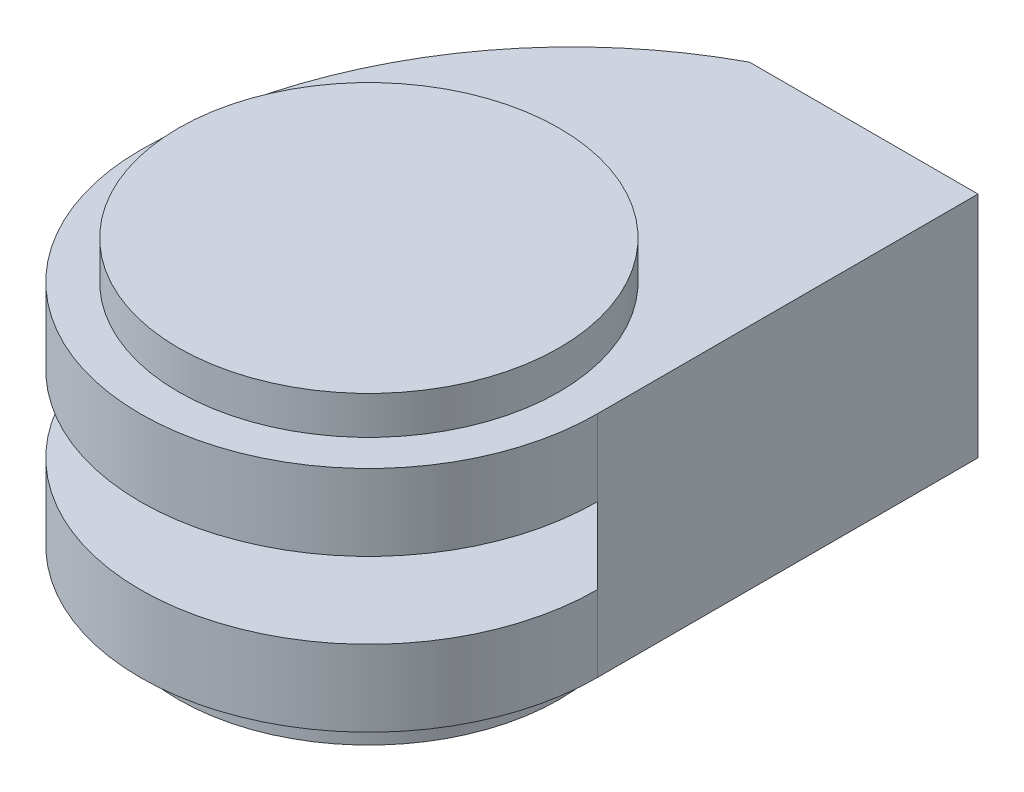
ISO-10303-21;
HEADER;
FILE_DESCRIPTION(('STEP AP214'),'2;1');
FILE_NAME('part.step','',(''),(''),'','','');
FILE_SCHEMA(('AUTOMOTIVE_DESIGN { 1 0 10303 214 1 1 1 1 }'));
ENDSEC;
DATA;
#1=APPLICATION_CONTEXT('core data for automotive mechanical design processes');
#2=APPLICATION_PROTOCOL_DEFINITION('international standard','automotive_design',2000,#1);
#3=PRODUCT_CONTEXT('',#1,'mechanical');
#4=PRODUCT('Part','Part','',(#3));
#5=PRODUCT_RELATED_PRODUCT_CATEGORY('part','',(#4));
#6=PRODUCT_DEFINITION_FORMATION('','',#4);
#7=PRODUCT_DEFINITION_CONTEXT('part definition',#1,'design');
#8=PRODUCT_DEFINITION('design','',#6,#7);
#9=PRODUCT_DEFINITION_SHAPE('','',#8);
#10=(LENGTH_UNIT() NAMED_UNIT(*) SI_UNIT(.MILLI.,.METRE.));
#11=(NAMED_UNIT(*) PLANE_ANGLE_UNIT() SI_UNIT($,.RADIAN.));
#12=(NAMED_UNIT(*) SI_UNIT($,.STERADIAN.) SOLID_ANGLE_UNIT());
#13=UNCERTAINTY_MEASURE_WITH_UNIT(LENGTH_MEASURE(1.E-05),#10,'distance_accuracy_value','');
#14=(GEOMETRIC_REPRESENTATION_CONTEXT(3) GLOBAL_UNCERTAINTY_ASSIGNED_CONTEXT((#13)) GLOBAL_UNIT_ASSIGNED_CONTEXT((#10,
#11,#12)) REPRESENTATION_CONTEXT('',''));
#15=CARTESIAN_POINT('',(0.,0.,0.));
#16=DIRECTION('',(0.,0.,1.));
#17=DIRECTION('',(1.,0.,0.));
#18=AXIS2_PLACEMENT_3D('',#15,#16,#17);
#19=CARTESIAN_POINT('',(0.,-1.5,2.5));
#20=DIRECTION('',(0.,1.,0.));
#21=DIRECTION('',(0.,0.,1.));
#22=AXIS2_PLACEMENT_3D('',#19,#20,#21);
#23=CYLINDRICAL_SURFACE('',#22,3.);
#24=DIRECTION('',(0.,1.,0.));
#25=VECTOR('',#24,1.);
#26=CARTESIAN_POINT('',(3.,-1.5,2.5));
#27=LINE('',#26,#25);
#28=CARTESIAN_POINT('',(3.,-1.5,2.5));
#29=VERTEX_POINT('',#28);
#30=CARTESIAN_POINT('',(3.,-0.5,2.5));
#31=VERTEX_POINT('',#30);
#32=EDGE_CURVE('E163',#29,#31,#27,.T.);
#33=ORIENTED_EDGE('',*,*,#32,.T.);
#34=CARTESIAN_POINT('',(0.,-0.5,2.5));
#35=DIRECTION('',(0.,1.,0.));
#36=DIRECTION('',(0.,0.,1.));
#37=AXIS2_PLACEMENT_3D('',#34,#35,#36);
#38=CIRCLE('',#37,3.);
#39=CARTESIAN_POINT('',(-3.,-0.5,2.5));
#40=VERTEX_POINT('',#39);
#41=EDGE_CURVE('E54',#40,#31,#38,.T.);
#42=ORIENTED_EDGE('',*,*,#41,.F.);
#43=DIRECTION('',(0.,1.,0.));
#44=VECTOR('',#43,1.);
#45=CARTESIAN_POINT('',(-3.,-1.5,2.5));
#46=LINE('',#45,#44);
#47=CARTESIAN_POINT('',(-3.,-1.5,2.5));
#48=VERTEX_POINT('',#47);
#49=EDGE_CURVE('E61',#48,#40,#46,.T.);
#50=ORIENTED_EDGE('',*,*,#49,.F.);
#51=CARTESIAN_POINT('',(0.,-1.5,2.5));
#52=DIRECTION('',(0.,1.,0.));
#53=DIRECTION('',(0.,0.,1.));
#54=AXIS2_PLACEMENT_3D('',#51,#52,#53);
#55=CIRCLE('',#54,3.);
#56=EDGE_CURVE('E146',#48,#29,#55,.T.);
#57=ORIENTED_EDGE('',*,*,#56,.T.);
#58=EDGE_LOOP('',(#33,#42,#50,#57));
#59=FACE_BOUND('',#58,.T.);
#60=ADVANCED_FACE('F37',(#59),#23,.T.);
#61=CARTESIAN_POINT('',(0.,0.5,2.5));
#62=DIRECTION('',(0.,1.,0.));
#63=DIRECTION('',(0.,0.,1.));
#64=AXIS2_PLACEMENT_3D('',#61,#62,#63);
#65=CIRCLE('',#64,3.);
#66=CARTESIAN_POINT('',(-3.,0.5,2.5));
#67=VERTEX_POINT('',#66);
#68=CARTESIAN_POINT('',(3.,0.5,2.5));
#69=VERTEX_POINT('',#68);
#70=EDGE_CURVE('E129',#67,#69,#65,.T.);
#71=ORIENTED_EDGE('',*,*,#70,.T.);
#72=CARTESIAN_POINT('',(3.,1.5,2.5));
#73=VERTEX_POINT('',#72);
#74=EDGE_CURVE('E157',#69,#73,#27,.T.);
#75=ORIENTED_EDGE('',*,*,#74,.T.);
#76=CARTESIAN_POINT('',(0.,1.5,2.5));
#77=DIRECTION('',(0.,1.,0.));
#78=DIRECTION('',(0.,0.,1.));
#79=AXIS2_PLACEMENT_3D('',#76,#77,#78);
#80=CIRCLE('',#79,3.);
#81=CARTESIAN_POINT('',(-3.,1.5,2.5));
#82=VERTEX_POINT('',#81);
#83=EDGE_CURVE('E134',#82,#73,#80,.T.);
#84=ORIENTED_EDGE('',*,*,#83,.F.);
#85=EDGE_CURVE('E159',#67,#82,#46,.T.);
#86=ORIENTED_EDGE('',*,*,#85,.F.);
#87=EDGE_LOOP('',(#71,#75,#84,#86));
#88=FACE_BOUND('',#87,.T.);
#89=ADVANCED_FACE('F39',(#88),#23,.T.);
#90=CARTESIAN_POINT('',(2.66666666666666,-1.5,2.5));
#91=DIRECTION('',(0.,1.,0.));
#92=DIRECTION('',(0.,0.,1.));
#93=AXIS2_PLACEMENT_3D('',#90,#91,#92);
#94=CYLINDRICAL_SURFACE('',#93,5.66666666666666);
#95=CARTESIAN_POINT('',(2.66666666666666,0.5,2.5));
#96=DIRECTION('',(0.,1.,0.));
#97=DIRECTION('',(0.,0.,1.));
#98=AXIS2_PLACEMENT_3D('',#95,#96,#97);
#99=CIRCLE('',#98,5.66666666666666);
#100=CARTESIAN_POINT('',(-0.474039748060163,0.5,-2.21668043517948));
#101=VERTEX_POINT('',#100);
#102=EDGE_CURVE('E127',#67,#101,#99,.F.);
#103=ORIENTED_EDGE('',*,*,#102,.F.);
#104=ORIENTED_EDGE('',*,*,#85,.T.);
#105=CARTESIAN_POINT('',(2.66666666666666,1.5,2.5));
#106=DIRECTION('',(0.,1.,0.));
#107=DIRECTION('',(0.,0.,1.));
#108=AXIS2_PLACEMENT_3D('',#105,#106,#107);
#109=CIRCLE('',#108,5.66666666666666);
#110=CARTESIAN_POINT('',(0.,1.5,-2.5));
#111=VERTEX_POINT('',#110);
#112=EDGE_CURVE('E143',#111,#82,#109,.T.);
#113=ORIENTED_EDGE('',*,*,#112,.F.);
#114=DIRECTION('',(0.,1.,0.));
#115=VECTOR('',#114,1.);
#116=CARTESIAN_POINT('',(0.,-1.5,-2.5));
#117=LINE('',#116,#115);
#118=CARTESIAN_POINT('',(0.,-1.5,-2.5));
#119=VERTEX_POINT('',#118);
#120=EDGE_CURVE('E160',#119,#111,#117,.T.);
#121=ORIENTED_EDGE('',*,*,#120,.F.);
#122=CARTESIAN_POINT('',(2.66666666666666,-1.5,2.5));
#123=DIRECTION('',(0.,1.,0.));
#124=DIRECTION('',(0.,0.,1.));
#125=AXIS2_PLACEMENT_3D('',#122,#123,#124);
#126=CIRCLE('',#125,5.66666666666666);
#127=EDGE_CURVE('E154',#119,#48,#126,.T.);
#128=ORIENTED_EDGE('',*,*,#127,.T.);
#129=ORIENTED_EDGE('',*,*,#49,.T.);
#130=CARTESIAN_POINT('',(2.66666666666666,-0.5,2.5));
#131=DIRECTION('',(0.,1.,0.));
#132=DIRECTION('',(0.,0.,1.));
#133=AXIS2_PLACEMENT_3D('',#130,#131,#132);
#134=CIRCLE('',#133,5.66666666666666);
#135=CARTESIAN_POINT('',(-0.474039748060163,-0.5,-2.21668043517948));
#136=VERTEX_POINT('',#135);
#137=EDGE_CURVE('E124',#40,#136,#134,.F.);
#138=ORIENTED_EDGE('',*,*,#137,.T.);
#139=DIRECTION('',(0.,1.,0.));
#140=VECTOR('',#139,1.);
#141=CARTESIAN_POINT('',(-0.474039748060163,-1.5,-2.21668043517948));
#142=LINE('',#141,#140);
#143=EDGE_CURVE('E41',#101,#136,#142,.F.);
#144=ORIENTED_EDGE('',*,*,#143,.F.);
#145=EDGE_LOOP('',(#103,#104,#113,#121,#128,#129,#138,#144));
#146=FACE_BOUND('',#145,.T.);
#147=ADVANCED_FACE('F180',(#146),#94,.T.);
#148=CARTESIAN_POINT('',(0.,-1.5,-2.5));
#149=DIRECTION('',(0.,0.,-1.));
#150=DIRECTION('',(-1.,0.,0.));
#151=AXIS2_PLACEMENT_3D('',#148,#149,#150);
#152=PLANE('',#151);
#153=ORIENTED_EDGE('',*,*,#120,.T.);
#154=DIRECTION('',(-1.,0.,0.));
#155=VECTOR('',#154,1.);
#156=CARTESIAN_POINT('',(0.,1.5,-2.5));
#157=LINE('',#156,#155);
#158=CARTESIAN_POINT('',(3.,1.5,-2.5));
#159=VERTEX_POINT('',#158);
#160=EDGE_CURVE('E140',#159,#111,#157,.T.);
#161=ORIENTED_EDGE('',*,*,#160,.F.);
#162=DIRECTION('',(0.,1.,0.));
#163=VECTOR('',#162,1.);
#164=CARTESIAN_POINT('',(3.,-1.5,-2.5));
#165=LINE('',#164,#163);
#166=CARTESIAN_POINT('',(3.,-1.5,-2.5));
#167=VERTEX_POINT('',#166);
#168=EDGE_CURVE('E162',#167,#159,#165,.T.);
#169=ORIENTED_EDGE('',*,*,#168,.F.);
#170=DIRECTION('',(-1.,0.,0.));
#171=VECTOR('',#170,1.);
#172=CARTESIAN_POINT('',(0.,-1.5,-2.5));
#173=LINE('',#172,#171);
#174=EDGE_CURVE('E151',#167,#119,#173,.T.);
#175=ORIENTED_EDGE('',*,*,#174,.T.);
#176=EDGE_LOOP('',(#153,#161,#169,#175));
#177=FACE_BOUND('',#176,.T.);
#178=ADVANCED_FACE('F215',(#177),#152,.T.);
#179=CARTESIAN_POINT('',(3.,-1.5,0.));
#180=DIRECTION('',(1.,0.,0.));
#181=DIRECTION('',(0.,0.,-1.));
#182=AXIS2_PLACEMENT_3D('',#179,#180,#181);
#183=PLANE('',#182);
#184=ORIENTED_EDGE('',*,*,#168,.T.);
#185=DIRECTION('',(0.,0.,-1.));
#186=VECTOR('',#185,1.);
#187=CARTESIAN_POINT('',(3.,1.5,0.));
#188=LINE('',#187,#186);
#189=EDGE_CURVE('E137',#73,#159,#188,.T.);
#190=ORIENTED_EDGE('',*,*,#189,.F.);
#191=ORIENTED_EDGE('',*,*,#74,.F.);
#192=EDGE_CURVE('E165',#31,#69,#27,.T.);
#193=ORIENTED_EDGE('',*,*,#192,.F.);
#194=ORIENTED_EDGE('',*,*,#32,.F.);
#195=DIRECTION('',(0.,0.,-1.));
#196=VECTOR('',#195,1.);
#197=CARTESIAN_POINT('',(3.,-1.5,0.));
#198=LINE('',#197,#196);
#199=EDGE_CURVE('E148',#29,#167,#198,.T.);
#200=ORIENTED_EDGE('',*,*,#199,.T.);
#201=EDGE_LOOP('',(#184,#190,#191,#193,#194,#200));
#202=FACE_BOUND('',#201,.T.);
#203=ADVANCED_FACE('F173',(#202),#183,.T.);
#204=CARTESIAN_POINT('',(0.,-1.5,0.));
#205=DIRECTION('',(0.,1.,0.));
#206=DIRECTION('',(0.,0.,1.));
#207=AXIS2_PLACEMENT_3D('',#204,#205,#206);
#208=PLANE('',#207);
#209=CARTESIAN_POINT('',(0.,-1.5,2.5));
#210=DIRECTION('',(0.,-1.,0.));
#211=DIRECTION('',(0.,0.,-1.));
#212=AXIS2_PLACEMENT_3D('',#209,#210,#211);
#213=CIRCLE('',#212,2.5);
#214=CARTESIAN_POINT('',(0.,-1.5,0.));
#215=VERTEX_POINT('',#214);
#216=EDGE_CURVE('E11',#215,#215,#213,.T.);
#217=ORIENTED_EDGE('',*,*,#216,.F.);
#218=EDGE_LOOP('',(#217));
#219=FACE_BOUND('',#218,.T.);
#220=ORIENTED_EDGE('',*,*,#56,.F.);
#221=ORIENTED_EDGE('',*,*,#127,.F.);
#222=ORIENTED_EDGE('',*,*,#174,.F.);
#223=ORIENTED_EDGE('',*,*,#199,.F.);
#224=EDGE_LOOP('',(#220,#221,#222,#223));
#225=FACE_BOUND('',#224,.T.);
#226=ADVANCED_FACE('F201',(#219,#225),#208,.F.);
#227=CARTESIAN_POINT('',(0.,1.5,0.));
#228=DIRECTION('',(0.,1.,0.));
#229=DIRECTION('',(0.,0.,1.));
#230=AXIS2_PLACEMENT_3D('',#227,#228,#229);
#231=PLANE('',#230);
#232=CARTESIAN_POINT('',(0.,1.5,2.5));
#233=DIRECTION('',(0.,1.,0.));
#234=DIRECTION('',(0.,0.,1.));
#235=AXIS2_PLACEMENT_3D('',#232,#233,#234);
#236=CIRCLE('',#235,2.5);
#237=CARTESIAN_POINT('',(0.,1.5,5.));
#238=VERTEX_POINT('',#237);
#239=EDGE_CURVE('E46',#238,#238,#236,.T.);
#240=ORIENTED_EDGE('',*,*,#239,.F.);
#241=EDGE_LOOP('',(#240));
#242=FACE_BOUND('',#241,.T.);
#243=ORIENTED_EDGE('',*,*,#83,.T.);
#244=ORIENTED_EDGE('',*,*,#189,.T.);
#245=ORIENTED_EDGE('',*,*,#160,.T.);
#246=ORIENTED_EDGE('',*,*,#112,.T.);
#247=EDGE_LOOP('',(#243,#244,#245,#246));
#248=FACE_BOUND('',#247,.T.);
#249=ADVANCED_FACE('F176',(#242,#248),#231,.T.);
#250=CARTESIAN_POINT('',(0.,0.5,2.5));
#251=DIRECTION('',(0.,-1.,0.));
#252=DIRECTION('',(0.,0.,-1.));
#253=AXIS2_PLACEMENT_3D('',#250,#251,#252);
#254=CYLINDRICAL_SURFACE('',#253,3.);
#255=ORIENTED_EDGE('',*,*,#192,.T.);
#256=CARTESIAN_POINT('',(2.12132034355965,0.5,0.378679656440368));
#257=VERTEX_POINT('',#256);
#258=EDGE_CURVE('E113',#69,#257,#65,.T.);
#259=ORIENTED_EDGE('',*,*,#258,.T.);
#260=DIRECTION('',(0.,-1.,0.));
#261=VECTOR('',#260,1.);
#262=CARTESIAN_POINT('',(2.12132034355965,0.5,0.378679656440368));
#263=LINE('',#262,#261);
#264=CARTESIAN_POINT('',(2.12132034355965,-0.5,0.378679656440368));
#265=VERTEX_POINT('',#264);
#266=EDGE_CURVE('E110',#257,#265,#263,.T.);
#267=ORIENTED_EDGE('',*,*,#266,.T.);
#268=EDGE_CURVE('E115',#31,#265,#38,.T.);
#269=ORIENTED_EDGE('',*,*,#268,.F.);
#270=EDGE_LOOP('',(#255,#259,#267,#269));
#271=FACE_BOUND('',#270,.T.);
#272=ADVANCED_FACE('F122',(#271),#254,.F.);
#273=CARTESIAN_POINT('',(0.871320343559654,0.5,-0.871320343559645));
#274=DIRECTION('',(0.707106781186551,0.,-0.707106781186544));
#275=DIRECTION('',(-0.707106781186544,0.,-0.707106781186551));
#276=AXIS2_PLACEMENT_3D('',#273,#274,#275);
#277=PLANE('',#276);
#278=ORIENTED_EDGE('',*,*,#143,.T.);
#279=DIRECTION('',(0.707106781186544,0.,0.707106781186551));
#280=VECTOR('',#279,1.);
#281=CARTESIAN_POINT('',(0.871320343559654,-0.5,-0.871320343559645));
#282=LINE('',#281,#280);
#283=EDGE_CURVE('E106',#136,#265,#282,.T.);
#284=ORIENTED_EDGE('',*,*,#283,.T.);
#285=ORIENTED_EDGE('',*,*,#266,.F.);
#286=DIRECTION('',(0.707106781186544,0.,0.707106781186551));
#287=VECTOR('',#286,1.);
#288=CARTESIAN_POINT('',(0.871320343559654,0.5,-0.871320343559645));
#289=LINE('',#288,#287);
#290=EDGE_CURVE('E125',#101,#257,#289,.T.);
#291=ORIENTED_EDGE('',*,*,#290,.F.);
#292=EDGE_LOOP('',(#278,#284,#285,#291));
#293=FACE_BOUND('',#292,.T.);
#294=ADVANCED_FACE('F107',(#293),#277,.F.);
#295=CARTESIAN_POINT('',(0.,0.5,0.));
#296=DIRECTION('',(0.,1.,0.));
#297=DIRECTION('',(0.,0.,1.));
#298=AXIS2_PLACEMENT_3D('',#295,#296,#297);
#299=PLANE('',#298);
#300=ORIENTED_EDGE('',*,*,#102,.T.);
#301=ORIENTED_EDGE('',*,*,#290,.T.);
#302=ORIENTED_EDGE('',*,*,#258,.F.);
#303=ORIENTED_EDGE('',*,*,#70,.F.);
#304=EDGE_LOOP('',(#300,#301,#302,#303));
#305=FACE_BOUND('',#304,.T.);
#306=ADVANCED_FACE('F182',(#305),#299,.F.);
#307=CARTESIAN_POINT('',(0.,-0.5,0.));
#308=DIRECTION('',(0.,1.,0.));
#309=DIRECTION('',(0.,0.,1.));
#310=AXIS2_PLACEMENT_3D('',#307,#308,#309);
#311=PLANE('',#310);
#312=ORIENTED_EDGE('',*,*,#41,.T.);
#313=ORIENTED_EDGE('',*,*,#268,.T.);
#314=ORIENTED_EDGE('',*,*,#283,.F.);
#315=ORIENTED_EDGE('',*,*,#137,.F.);
#316=EDGE_LOOP('',(#312,#313,#314,#315));
#317=FACE_BOUND('',#316,.T.);
#318=ADVANCED_FACE('F116',(#317),#311,.T.);
#319=CARTESIAN_POINT('',(0.,2.,2.5));
#320=DIRECTION('',(0.,-1.,0.));
#321=DIRECTION('',(0.,0.,-1.));
#322=AXIS2_PLACEMENT_3D('',#319,#320,#321);
#323=CYLINDRICAL_SURFACE('',#322,2.5);
#324=CARTESIAN_POINT('',(0.,2.,2.5));
#325=DIRECTION('',(0.,1.,0.));
#326=DIRECTION('',(0.,0.,1.));
#327=AXIS2_PLACEMENT_3D('',#324,#325,#326);
#328=CIRCLE('',#327,2.5);
#329=CARTESIAN_POINT('',(0.,2.,5.));
#330=VERTEX_POINT('',#329);
#331=EDGE_CURVE('E119',#330,#330,#328,.T.);
#332=ORIENTED_EDGE('',*,*,#331,.F.);
#333=EDGE_LOOP('',(#332));
#334=FACE_BOUND('',#333,.T.);
#335=ORIENTED_EDGE('',*,*,#239,.T.);
#336=EDGE_LOOP('',(#335));
#337=FACE_BOUND('',#336,.T.);
#338=ADVANCED_FACE('F265',(#334,#337),#323,.T.);
#339=CARTESIAN_POINT('',(0.,2.,2.5));
#340=DIRECTION('',(0.,1.,0.));
#341=DIRECTION('',(0.,0.,1.));
#342=AXIS2_PLACEMENT_3D('',#339,#340,#341);
#343=PLANE('',#342);
#344=ORIENTED_EDGE('',*,*,#331,.T.);
#345=EDGE_LOOP('',(#344));
#346=FACE_BOUND('',#345,.T.);
#347=ADVANCED_FACE('F197',(#346),#343,.T.);
#348=CARTESIAN_POINT('',(0.,-2.,2.5));
#349=DIRECTION('',(0.,1.,0.));
#350=DIRECTION('',(0.,0.,1.));
#351=AXIS2_PLACEMENT_3D('',#348,#349,#350);
#352=CYLINDRICAL_SURFACE('',#351,2.5);
#353=CARTESIAN_POINT('',(0.,-2.,2.5));
#354=DIRECTION('',(0.,-1.,0.));
#355=DIRECTION('',(0.,0.,-1.));
#356=AXIS2_PLACEMENT_3D('',#353,#354,#355);
#357=CIRCLE('',#356,2.5);
#358=CARTESIAN_POINT('',(0.,-2.,0.));
#359=VERTEX_POINT('',#358);
#360=EDGE_CURVE('E187',#359,#359,#357,.T.);
#361=ORIENTED_EDGE('',*,*,#360,.F.);
#362=EDGE_LOOP('',(#361));
#363=FACE_BOUND('',#362,.T.);
#364=ORIENTED_EDGE('',*,*,#216,.T.);
#365=EDGE_LOOP('',(#364));
#366=FACE_BOUND('',#365,.T.);
#367=ADVANCED_FACE('F194',(#363,#366),#352,.T.);
#368=CARTESIAN_POINT('',(0.,-2.,2.5));
#369=DIRECTION('',(0.,-1.,0.));
#370=DIRECTION('',(0.,0.,-1.));
#371=AXIS2_PLACEMENT_3D('',#368,#369,#370);
#372=PLANE('',#371);
#373=ORIENTED_EDGE('',*,*,#360,.T.);
#374=EDGE_LOOP('',(#373));
#375=FACE_BOUND('',#374,.T.);
#376=ADVANCED_FACE('F192',(#375),#372,.T.);
#377=CLOSED_SHELL('',(#60,#89,#147,#178,#203,#226,#249,#272,#294,#306,#318,#338,#347,#367,#376));
#378=MANIFOLD_SOLID_BREP('B2',#377);
#379=ADVANCED_BREP_SHAPE_REPRESENTATION('',(#18,#378),#14);
#380=SHAPE_DEFINITION_REPRESENTATION(#9,#379);
ENDSEC;
END-ISO-10303-21;
